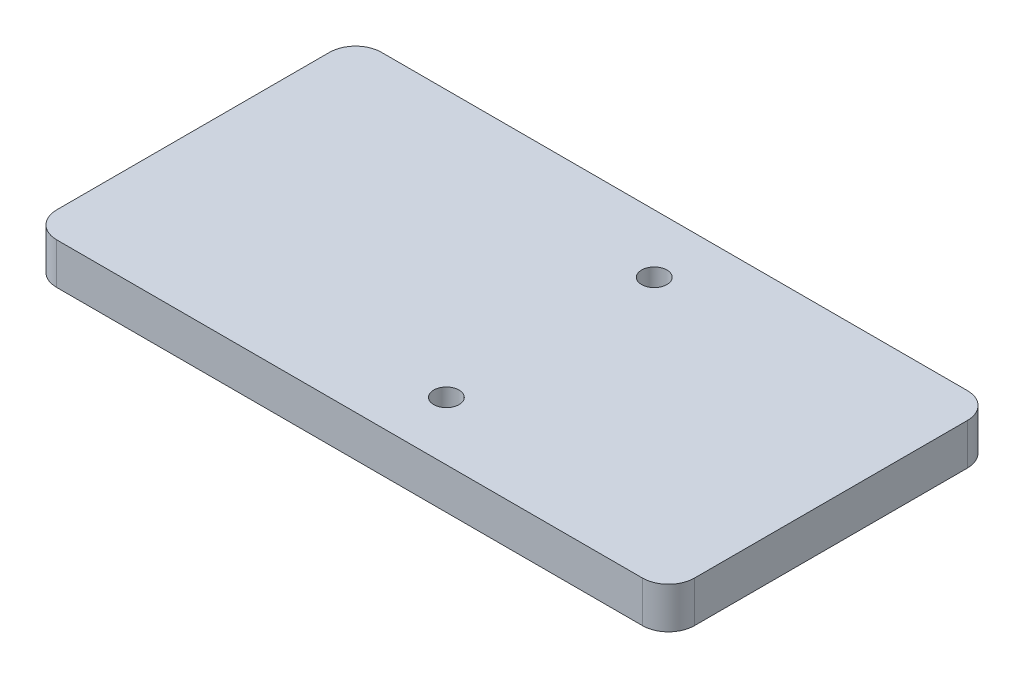
ISO-10303-21;
HEADER;
FILE_DESCRIPTION(('STEP AP214'),'2;1');
FILE_NAME('part.step','',(''),(''),'','','');
FILE_SCHEMA(('AUTOMOTIVE_DESIGN { 1 0 10303 214 1 1 1 1 }'));
ENDSEC;
DATA;
#1=APPLICATION_CONTEXT('core data for automotive mechanical design processes');
#2=APPLICATION_PROTOCOL_DEFINITION('international standard','automotive_design',2000,#1);
#3=PRODUCT_CONTEXT('',#1,'mechanical');
#4=PRODUCT('Part','Part','',(#3));
#5=PRODUCT_RELATED_PRODUCT_CATEGORY('part','',(#4));
#6=PRODUCT_DEFINITION_FORMATION('','',#4);
#7=PRODUCT_DEFINITION_CONTEXT('part definition',#1,'design');
#8=PRODUCT_DEFINITION('design','',#6,#7);
#9=PRODUCT_DEFINITION_SHAPE('','',#8);
#10=(LENGTH_UNIT() NAMED_UNIT(*) SI_UNIT(.MILLI.,.METRE.));
#11=(NAMED_UNIT(*) PLANE_ANGLE_UNIT() SI_UNIT($,.RADIAN.));
#12=(NAMED_UNIT(*) SI_UNIT($,.STERADIAN.) SOLID_ANGLE_UNIT());
#13=UNCERTAINTY_MEASURE_WITH_UNIT(LENGTH_MEASURE(1.E-05),#10,'distance_accuracy_value','');
#14=(GEOMETRIC_REPRESENTATION_CONTEXT(3) GLOBAL_UNCERTAINTY_ASSIGNED_CONTEXT((#13)) GLOBAL_UNIT_ASSIGNED_CONTEXT((#10,
#11,#12)) REPRESENTATION_CONTEXT('',''));
#15=CARTESIAN_POINT('',(0.,0.,0.));
#16=DIRECTION('',(0.,0.,1.));
#17=DIRECTION('',(1.,0.,0.));
#18=AXIS2_PLACEMENT_3D('',#15,#16,#17);
#19=CARTESIAN_POINT('',(0.,6.35,0.));
#20=DIRECTION('',(0.,1.,0.));
#21=DIRECTION('',(0.,0.,1.));
#22=AXIS2_PLACEMENT_3D('',#19,#20,#21);
#23=PLANE('',#22);
#24=CARTESIAN_POINT('',(5.9,6.35,-16.));
#25=DIRECTION('',(0.,1.,0.));
#26=DIRECTION('',(0.,0.,1.));
#27=AXIS2_PLACEMENT_3D('',#24,#25,#26);
#28=CIRCLE('',#27,1.95);
#29=CARTESIAN_POINT('',(5.9,6.35,-14.05));
#30=VERTEX_POINT('',#29);
#31=EDGE_CURVE('E168',#30,#30,#28,.T.);
#32=ORIENTED_EDGE('',*,*,#31,.F.);
#33=EDGE_LOOP('',(#32));
#34=FACE_BOUND('',#33,.T.);
#35=DIRECTION('',(0.,0.,1.));
#36=VECTOR('',#35,1.);
#37=CARTESIAN_POINT('',(-49.09,6.35,-25.));
#38=LINE('',#37,#36);
#39=CARTESIAN_POINT('',(-49.09,6.35,-21.));
#40=VERTEX_POINT('',#39);
#41=CARTESIAN_POINT('',(-49.09,6.35,21.));
#42=VERTEX_POINT('',#41);
#43=EDGE_CURVE('E172',#40,#42,#38,.T.);
#44=ORIENTED_EDGE('',*,*,#43,.T.);
#45=CARTESIAN_POINT('',(-45.09,6.35,21.));
#46=DIRECTION('',(0.,1.,0.));
#47=DIRECTION('',(0.,0.,1.));
#48=AXIS2_PLACEMENT_3D('',#45,#46,#47);
#49=CIRCLE('',#48,4.);
#50=CARTESIAN_POINT('',(-45.09,6.35,25.));
#51=VERTEX_POINT('',#50);
#52=EDGE_CURVE('E149',#42,#51,#49,.T.);
#53=ORIENTED_EDGE('',*,*,#52,.T.);
#54=DIRECTION('',(1.,0.,0.));
#55=VECTOR('',#54,1.);
#56=CARTESIAN_POINT('',(-49.09,6.35,25.));
#57=LINE('',#56,#55);
#58=CARTESIAN_POINT('',(45.09,6.35,25.));
#59=VERTEX_POINT('',#58);
#60=EDGE_CURVE('E120',#51,#59,#57,.T.);
#61=ORIENTED_EDGE('',*,*,#60,.T.);
#62=CARTESIAN_POINT('',(45.09,6.35,21.));
#63=DIRECTION('',(0.,1.,0.));
#64=DIRECTION('',(0.,0.,1.));
#65=AXIS2_PLACEMENT_3D('',#62,#63,#64);
#66=CIRCLE('',#65,4.);
#67=CARTESIAN_POINT('',(49.09,6.35,21.));
#68=VERTEX_POINT('',#67);
#69=EDGE_CURVE('E145',#59,#68,#66,.T.);
#70=ORIENTED_EDGE('',*,*,#69,.T.);
#71=DIRECTION('',(0.,0.,-1.));
#72=VECTOR('',#71,1.);
#73=CARTESIAN_POINT('',(49.09,6.35,-25.));
#74=LINE('',#73,#72);
#75=CARTESIAN_POINT('',(49.09,6.35,-21.));
#76=VERTEX_POINT('',#75);
#77=EDGE_CURVE('E128',#68,#76,#74,.T.);
#78=ORIENTED_EDGE('',*,*,#77,.T.);
#79=CARTESIAN_POINT('',(45.09,6.35,-21.));
#80=DIRECTION('',(0.,1.,0.));
#81=DIRECTION('',(0.,0.,1.));
#82=AXIS2_PLACEMENT_3D('',#79,#80,#81);
#83=CIRCLE('',#82,4.);
#84=CARTESIAN_POINT('',(45.09,6.35,-25.));
#85=VERTEX_POINT('',#84);
#86=EDGE_CURVE('E55',#76,#85,#83,.T.);
#87=ORIENTED_EDGE('',*,*,#86,.T.);
#88=DIRECTION('',(-1.,0.,0.));
#89=VECTOR('',#88,1.);
#90=CARTESIAN_POINT('',(-49.09,6.35,-25.));
#91=LINE('',#90,#89);
#92=CARTESIAN_POINT('',(-45.09,6.35,-25.));
#93=VERTEX_POINT('',#92);
#94=EDGE_CURVE('E131',#85,#93,#91,.T.);
#95=ORIENTED_EDGE('',*,*,#94,.T.);
#96=CARTESIAN_POINT('',(-45.09,6.35,-21.));
#97=DIRECTION('',(0.,1.,0.));
#98=DIRECTION('',(0.,0.,1.));
#99=AXIS2_PLACEMENT_3D('',#96,#97,#98);
#100=CIRCLE('',#99,4.);
#101=EDGE_CURVE('E147',#93,#40,#100,.T.);
#102=ORIENTED_EDGE('',*,*,#101,.T.);
#103=EDGE_LOOP('',(#44,#53,#61,#70,#78,#87,#95,#102));
#104=FACE_BOUND('',#103,.T.);
#105=CARTESIAN_POINT('',(5.9,6.35,16.));
#106=DIRECTION('',(0.,1.,0.));
#107=DIRECTION('',(0.,0.,1.));
#108=AXIS2_PLACEMENT_3D('',#105,#106,#107);
#109=CIRCLE('',#108,1.95);
#110=CARTESIAN_POINT('',(5.9,6.35,17.95));
#111=VERTEX_POINT('',#110);
#112=EDGE_CURVE('E178',#111,#111,#109,.T.);
#113=ORIENTED_EDGE('',*,*,#112,.F.);
#114=EDGE_LOOP('',(#113));
#115=FACE_BOUND('',#114,.T.);
#116=ADVANCED_FACE('F33',(#34,#104,#115),#23,.T.);
#117=CARTESIAN_POINT('',(0.,0.,0.));
#118=DIRECTION('',(0.,1.,0.));
#119=DIRECTION('',(0.,0.,1.));
#120=AXIS2_PLACEMENT_3D('',#117,#118,#119);
#121=PLANE('',#120);
#122=DIRECTION('',(1.,0.,0.));
#123=VECTOR('',#122,1.);
#124=CARTESIAN_POINT('',(-49.09,0.,25.));
#125=LINE('',#124,#123);
#126=CARTESIAN_POINT('',(-45.09,0.,25.));
#127=VERTEX_POINT('',#126);
#128=CARTESIAN_POINT('',(45.09,0.,25.));
#129=VERTEX_POINT('',#128);
#130=EDGE_CURVE('E117',#127,#129,#125,.T.);
#131=ORIENTED_EDGE('',*,*,#130,.F.);
#132=CARTESIAN_POINT('',(-45.09,0.,21.));
#133=DIRECTION('',(0.,1.,0.));
#134=DIRECTION('',(0.,0.,1.));
#135=AXIS2_PLACEMENT_3D('',#132,#133,#134);
#136=CIRCLE('',#135,4.);
#137=CARTESIAN_POINT('',(-49.09,0.,21.));
#138=VERTEX_POINT('',#137);
#139=EDGE_CURVE('E100',#127,#138,#136,.F.);
#140=ORIENTED_EDGE('',*,*,#139,.T.);
#141=DIRECTION('',(0.,0.,1.));
#142=VECTOR('',#141,1.);
#143=CARTESIAN_POINT('',(-49.09,0.,-25.));
#144=LINE('',#143,#142);
#145=CARTESIAN_POINT('',(-49.09,0.,-21.));
#146=VERTEX_POINT('',#145);
#147=EDGE_CURVE('E129',#146,#138,#144,.T.);
#148=ORIENTED_EDGE('',*,*,#147,.F.);
#149=CARTESIAN_POINT('',(-45.09,0.,-21.));
#150=DIRECTION('',(0.,1.,0.));
#151=DIRECTION('',(0.,0.,1.));
#152=AXIS2_PLACEMENT_3D('',#149,#150,#151);
#153=CIRCLE('',#152,4.);
#154=CARTESIAN_POINT('',(-45.09,0.,-25.));
#155=VERTEX_POINT('',#154);
#156=EDGE_CURVE('E111',#146,#155,#153,.F.);
#157=ORIENTED_EDGE('',*,*,#156,.T.);
#158=DIRECTION('',(-1.,0.,0.));
#159=VECTOR('',#158,1.);
#160=CARTESIAN_POINT('',(-49.09,0.,-25.));
#161=LINE('',#160,#159);
#162=CARTESIAN_POINT('',(45.09,0.,-25.));
#163=VERTEX_POINT('',#162);
#164=EDGE_CURVE('E133',#163,#155,#161,.T.);
#165=ORIENTED_EDGE('',*,*,#164,.F.);
#166=CARTESIAN_POINT('',(45.09,0.,-21.));
#167=DIRECTION('',(0.,1.,0.));
#168=DIRECTION('',(0.,0.,1.));
#169=AXIS2_PLACEMENT_3D('',#166,#167,#168);
#170=CIRCLE('',#169,4.);
#171=CARTESIAN_POINT('',(49.09,0.,-21.));
#172=VERTEX_POINT('',#171);
#173=EDGE_CURVE('E121',#163,#172,#170,.F.);
#174=ORIENTED_EDGE('',*,*,#173,.T.);
#175=DIRECTION('',(0.,0.,-1.));
#176=VECTOR('',#175,1.);
#177=CARTESIAN_POINT('',(49.09,0.,-25.));
#178=LINE('',#177,#176);
#179=CARTESIAN_POINT('',(49.09,0.,21.));
#180=VERTEX_POINT('',#179);
#181=EDGE_CURVE('E160',#180,#172,#178,.T.);
#182=ORIENTED_EDGE('',*,*,#181,.F.);
#183=CARTESIAN_POINT('',(45.09,0.,21.));
#184=DIRECTION('',(0.,1.,0.));
#185=DIRECTION('',(0.,0.,1.));
#186=AXIS2_PLACEMENT_3D('',#183,#184,#185);
#187=CIRCLE('',#186,4.);
#188=EDGE_CURVE('E127',#180,#129,#187,.F.);
#189=ORIENTED_EDGE('',*,*,#188,.T.);
#190=EDGE_LOOP('',(#131,#140,#148,#157,#165,#174,#182,#189));
#191=FACE_BOUND('',#190,.T.);
#192=CARTESIAN_POINT('',(5.9,0.,-16.));
#193=DIRECTION('',(0.,1.,0.));
#194=DIRECTION('',(0.,0.,1.));
#195=AXIS2_PLACEMENT_3D('',#192,#193,#194);
#196=CIRCLE('',#195,1.95);
#197=CARTESIAN_POINT('',(5.9,0.,-14.05));
#198=VERTEX_POINT('',#197);
#199=EDGE_CURVE('E175',#198,#198,#196,.T.);
#200=ORIENTED_EDGE('',*,*,#199,.T.);
#201=EDGE_LOOP('',(#200));
#202=FACE_BOUND('',#201,.T.);
#203=CARTESIAN_POINT('',(5.9,0.,16.));
#204=DIRECTION('',(0.,1.,0.));
#205=DIRECTION('',(0.,0.,1.));
#206=AXIS2_PLACEMENT_3D('',#203,#204,#205);
#207=CIRCLE('',#206,1.95);
#208=CARTESIAN_POINT('',(5.9,0.,17.95));
#209=VERTEX_POINT('',#208);
#210=EDGE_CURVE('E181',#209,#209,#207,.T.);
#211=ORIENTED_EDGE('',*,*,#210,.T.);
#212=EDGE_LOOP('',(#211));
#213=FACE_BOUND('',#212,.T.);
#214=ADVANCED_FACE('F124',(#191,#202,#213),#121,.F.);
#215=CARTESIAN_POINT('',(49.09,6.35,-25.));
#216=DIRECTION('',(-1.,0.,0.));
#217=DIRECTION('',(0.,0.,1.));
#218=AXIS2_PLACEMENT_3D('',#215,#216,#217);
#219=PLANE('',#218);
#220=ORIENTED_EDGE('',*,*,#77,.F.);
#221=DIRECTION('',(0.,-1.,0.));
#222=VECTOR('',#221,1.);
#223=CARTESIAN_POINT('',(49.09,6.35,21.));
#224=LINE('',#223,#222);
#225=EDGE_CURVE('E11',#68,#180,#224,.T.);
#226=ORIENTED_EDGE('',*,*,#225,.T.);
#227=ORIENTED_EDGE('',*,*,#181,.T.);
#228=DIRECTION('',(0.,-1.,0.));
#229=VECTOR('',#228,1.);
#230=CARTESIAN_POINT('',(49.09,6.35,-21.));
#231=LINE('',#230,#229);
#232=EDGE_CURVE('E41',#172,#76,#231,.F.);
#233=ORIENTED_EDGE('',*,*,#232,.T.);
#234=EDGE_LOOP('',(#220,#226,#227,#233));
#235=FACE_BOUND('',#234,.T.);
#236=ADVANCED_FACE('F158',(#235),#219,.F.);
#237=CARTESIAN_POINT('',(-49.09,6.35,-25.));
#238=DIRECTION('',(0.,0.,1.));
#239=DIRECTION('',(1.,0.,0.));
#240=AXIS2_PLACEMENT_3D('',#237,#238,#239);
#241=PLANE('',#240);
#242=ORIENTED_EDGE('',*,*,#164,.T.);
#243=DIRECTION('',(0.,-1.,0.));
#244=VECTOR('',#243,1.);
#245=CARTESIAN_POINT('',(-45.09,6.35,-25.));
#246=LINE('',#245,#244);
#247=EDGE_CURVE('E48',#155,#93,#246,.F.);
#248=ORIENTED_EDGE('',*,*,#247,.T.);
#249=ORIENTED_EDGE('',*,*,#94,.F.);
#250=DIRECTION('',(0.,-1.,0.));
#251=VECTOR('',#250,1.);
#252=CARTESIAN_POINT('',(45.09,6.35,-25.));
#253=LINE('',#252,#251);
#254=EDGE_CURVE('E151',#85,#163,#253,.T.);
#255=ORIENTED_EDGE('',*,*,#254,.T.);
#256=EDGE_LOOP('',(#242,#248,#249,#255));
#257=FACE_BOUND('',#256,.T.);
#258=ADVANCED_FACE('F167',(#257),#241,.F.);
#259=CARTESIAN_POINT('',(-49.09,6.35,-25.));
#260=DIRECTION('',(1.,0.,0.));
#261=DIRECTION('',(0.,0.,-1.));
#262=AXIS2_PLACEMENT_3D('',#259,#260,#261);
#263=PLANE('',#262);
#264=ORIENTED_EDGE('',*,*,#147,.T.);
#265=DIRECTION('',(0.,-1.,0.));
#266=VECTOR('',#265,1.);
#267=CARTESIAN_POINT('',(-49.09,6.35,21.));
#268=LINE('',#267,#266);
#269=EDGE_CURVE('E105',#138,#42,#268,.F.);
#270=ORIENTED_EDGE('',*,*,#269,.T.);
#271=ORIENTED_EDGE('',*,*,#43,.F.);
#272=DIRECTION('',(0.,-1.,0.));
#273=VECTOR('',#272,1.);
#274=CARTESIAN_POINT('',(-49.09,6.35,-21.));
#275=LINE('',#274,#273);
#276=EDGE_CURVE('E110',#40,#146,#275,.T.);
#277=ORIENTED_EDGE('',*,*,#276,.T.);
#278=EDGE_LOOP('',(#264,#270,#271,#277));
#279=FACE_BOUND('',#278,.T.);
#280=ADVANCED_FACE('F203',(#279),#263,.F.);
#281=CARTESIAN_POINT('',(-49.09,6.35,25.));
#282=DIRECTION('',(0.,0.,-1.));
#283=DIRECTION('',(-1.,0.,0.));
#284=AXIS2_PLACEMENT_3D('',#281,#282,#283);
#285=PLANE('',#284);
#286=ORIENTED_EDGE('',*,*,#60,.F.);
#287=DIRECTION('',(0.,-1.,0.));
#288=VECTOR('',#287,1.);
#289=CARTESIAN_POINT('',(-45.09,6.35,25.));
#290=LINE('',#289,#288);
#291=EDGE_CURVE('E104',#51,#127,#290,.T.);
#292=ORIENTED_EDGE('',*,*,#291,.T.);
#293=ORIENTED_EDGE('',*,*,#130,.T.);
#294=DIRECTION('',(0.,-1.,0.));
#295=VECTOR('',#294,1.);
#296=CARTESIAN_POINT('',(45.09,6.35,25.));
#297=LINE('',#296,#295);
#298=EDGE_CURVE('E122',#129,#59,#297,.F.);
#299=ORIENTED_EDGE('',*,*,#298,.T.);
#300=EDGE_LOOP('',(#286,#292,#293,#299));
#301=FACE_BOUND('',#300,.T.);
#302=ADVANCED_FACE('F116',(#301),#285,.F.);
#303=CARTESIAN_POINT('',(5.9,6.35,-16.));
#304=DIRECTION('',(0.,-1.,0.));
#305=DIRECTION('',(0.,0.,-1.));
#306=AXIS2_PLACEMENT_3D('',#303,#304,#305);
#307=CYLINDRICAL_SURFACE('',#306,1.95);
#308=ORIENTED_EDGE('',*,*,#31,.T.);
#309=EDGE_LOOP('',(#308));
#310=FACE_BOUND('',#309,.T.);
#311=ORIENTED_EDGE('',*,*,#199,.F.);
#312=EDGE_LOOP('',(#311));
#313=FACE_BOUND('',#312,.T.);
#314=ADVANCED_FACE('F198',(#310,#313),#307,.F.);
#315=CARTESIAN_POINT('',(5.9,6.35,16.));
#316=DIRECTION('',(0.,-1.,0.));
#317=DIRECTION('',(0.,0.,-1.));
#318=AXIS2_PLACEMENT_3D('',#315,#316,#317);
#319=CYLINDRICAL_SURFACE('',#318,1.95);
#320=ORIENTED_EDGE('',*,*,#112,.T.);
#321=EDGE_LOOP('',(#320));
#322=FACE_BOUND('',#321,.T.);
#323=ORIENTED_EDGE('',*,*,#210,.F.);
#324=EDGE_LOOP('',(#323));
#325=FACE_BOUND('',#324,.T.);
#326=ADVANCED_FACE('F187',(#322,#325),#319,.F.);
#327=CARTESIAN_POINT('',(-45.09,6.35,21.));
#328=DIRECTION('',(0.,-1.,0.));
#329=DIRECTION('',(0.,0.,-1.));
#330=AXIS2_PLACEMENT_3D('',#327,#328,#329);
#331=CYLINDRICAL_SURFACE('',#330,4.);
#332=ORIENTED_EDGE('',*,*,#52,.F.);
#333=ORIENTED_EDGE('',*,*,#269,.F.);
#334=ORIENTED_EDGE('',*,*,#139,.F.);
#335=ORIENTED_EDGE('',*,*,#291,.F.);
#336=EDGE_LOOP('',(#332,#333,#334,#335));
#337=FACE_BOUND('',#336,.T.);
#338=ADVANCED_FACE('F103',(#337),#331,.T.);
#339=CARTESIAN_POINT('',(-45.09,6.35,-21.));
#340=DIRECTION('',(0.,-1.,0.));
#341=DIRECTION('',(0.,0.,-1.));
#342=AXIS2_PLACEMENT_3D('',#339,#340,#341);
#343=CYLINDRICAL_SURFACE('',#342,4.);
#344=ORIENTED_EDGE('',*,*,#101,.F.);
#345=ORIENTED_EDGE('',*,*,#247,.F.);
#346=ORIENTED_EDGE('',*,*,#156,.F.);
#347=ORIENTED_EDGE('',*,*,#276,.F.);
#348=EDGE_LOOP('',(#344,#345,#346,#347));
#349=FACE_BOUND('',#348,.T.);
#350=ADVANCED_FACE('F213',(#349),#343,.T.);
#351=CARTESIAN_POINT('',(45.09,6.35,21.));
#352=DIRECTION('',(0.,-1.,0.));
#353=DIRECTION('',(0.,0.,-1.));
#354=AXIS2_PLACEMENT_3D('',#351,#352,#353);
#355=CYLINDRICAL_SURFACE('',#354,4.);
#356=ORIENTED_EDGE('',*,*,#69,.F.);
#357=ORIENTED_EDGE('',*,*,#298,.F.);
#358=ORIENTED_EDGE('',*,*,#188,.F.);
#359=ORIENTED_EDGE('',*,*,#225,.F.);
#360=EDGE_LOOP('',(#356,#357,#358,#359));
#361=FACE_BOUND('',#360,.T.);
#362=ADVANCED_FACE('F215',(#361),#355,.T.);
#363=CARTESIAN_POINT('',(45.09,6.35,-21.));
#364=DIRECTION('',(0.,-1.,0.));
#365=DIRECTION('',(0.,0.,-1.));
#366=AXIS2_PLACEMENT_3D('',#363,#364,#365);
#367=CYLINDRICAL_SURFACE('',#366,4.);
#368=ORIENTED_EDGE('',*,*,#86,.F.);
#369=ORIENTED_EDGE('',*,*,#232,.F.);
#370=ORIENTED_EDGE('',*,*,#173,.F.);
#371=ORIENTED_EDGE('',*,*,#254,.F.);
#372=EDGE_LOOP('',(#368,#369,#370,#371));
#373=FACE_BOUND('',#372,.T.);
#374=ADVANCED_FACE('F35',(#373),#367,.T.);
#375=CLOSED_SHELL('',(#116,#214,#236,#258,#280,#302,#314,#326,#338,#350,#362,#374));
#376=MANIFOLD_SOLID_BREP('B2',#375);
#377=ADVANCED_BREP_SHAPE_REPRESENTATION('',(#18,#376),#14);
#378=SHAPE_DEFINITION_REPRESENTATION(#9,#377);
ENDSEC;
END-ISO-10303-21;
